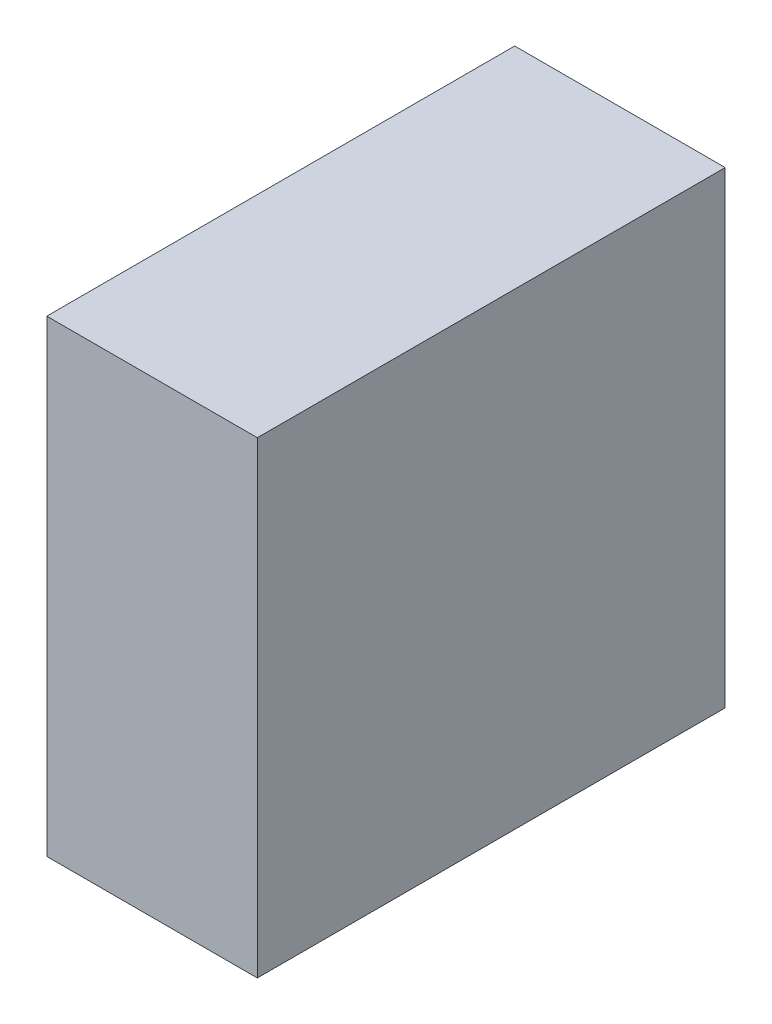
ISO-10303-21;
HEADER;
FILE_DESCRIPTION(('STEP AP214'),'2;1');
FILE_NAME('part.step','',(''),(''),'','','');
FILE_SCHEMA(('AUTOMOTIVE_DESIGN { 1 0 10303 214 1 1 1 1 }'));
ENDSEC;
DATA;
#1=APPLICATION_CONTEXT('core data for automotive mechanical design processes');
#2=APPLICATION_PROTOCOL_DEFINITION('international standard','automotive_design',2000,#1);
#3=PRODUCT_CONTEXT('',#1,'mechanical');
#4=PRODUCT('Part','Part','',(#3));
#5=PRODUCT_RELATED_PRODUCT_CATEGORY('part','',(#4));
#6=PRODUCT_DEFINITION_FORMATION('','',#4);
#7=PRODUCT_DEFINITION_CONTEXT('part definition',#1,'design');
#8=PRODUCT_DEFINITION('design','',#6,#7);
#9=PRODUCT_DEFINITION_SHAPE('','',#8);
#10=(LENGTH_UNIT() NAMED_UNIT(*) SI_UNIT(.MILLI.,.METRE.));
#11=(NAMED_UNIT(*) PLANE_ANGLE_UNIT() SI_UNIT($,.RADIAN.));
#12=(NAMED_UNIT(*) SI_UNIT($,.STERADIAN.) SOLID_ANGLE_UNIT());
#13=UNCERTAINTY_MEASURE_WITH_UNIT(LENGTH_MEASURE(1.E-05),#10,'distance_accuracy_value','');
#14=(GEOMETRIC_REPRESENTATION_CONTEXT(3) GLOBAL_UNCERTAINTY_ASSIGNED_CONTEXT((#13)) GLOBAL_UNIT_ASSIGNED_CONTEXT((#10,
#11,#12)) REPRESENTATION_CONTEXT('',''));
#15=CARTESIAN_POINT('',(0.,0.,0.));
#16=DIRECTION('',(0.,0.,1.));
#17=DIRECTION('',(1.,0.,0.));
#18=AXIS2_PLACEMENT_3D('',#15,#16,#17);
#19=CARTESIAN_POINT('',(450.,180.,-248.));
#20=DIRECTION('',(-1.,0.,0.));
#21=DIRECTION('',(0.,0.,1.));
#22=AXIS2_PLACEMENT_3D('',#19,#20,#21);
#23=PLANE('',#22);
#24=DIRECTION('',(0.,-1.,0.));
#25=VECTOR('',#24,1.);
#26=CARTESIAN_POINT('',(450.,180.,-148.));
#27=LINE('',#26,#25);
#28=CARTESIAN_POINT('',(450.,280.,-148.));
#29=VERTEX_POINT('',#28);
#30=CARTESIAN_POINT('',(450.,180.,-148.));
#31=VERTEX_POINT('',#30);
#32=EDGE_CURVE('E103',#29,#31,#27,.T.);
#33=ORIENTED_EDGE('',*,*,#32,.F.);
#34=DIRECTION('',(0.,0.,1.));
#35=VECTOR('',#34,1.);
#36=CARTESIAN_POINT('',(450.,280.,-248.));
#37=LINE('',#36,#35);
#38=CARTESIAN_POINT('',(450.,280.,-248.));
#39=VERTEX_POINT('',#38);
#40=EDGE_CURVE('E11',#39,#29,#37,.T.);
#41=ORIENTED_EDGE('',*,*,#40,.F.);
#42=DIRECTION('',(0.,-1.,0.));
#43=VECTOR('',#42,1.);
#44=CARTESIAN_POINT('',(450.,180.,-248.));
#45=LINE('',#44,#43);
#46=CARTESIAN_POINT('',(450.,180.,-248.));
#47=VERTEX_POINT('',#46);
#48=EDGE_CURVE('E97',#39,#47,#45,.T.);
#49=ORIENTED_EDGE('',*,*,#48,.T.);
#50=DIRECTION('',(0.,0.,1.));
#51=VECTOR('',#50,1.);
#52=CARTESIAN_POINT('',(450.,180.,-248.));
#53=LINE('',#52,#51);
#54=EDGE_CURVE('E42',#47,#31,#53,.T.);
#55=ORIENTED_EDGE('',*,*,#54,.T.);
#56=EDGE_LOOP('',(#33,#41,#49,#55));
#57=FACE_BOUND('',#56,.T.);
#58=ADVANCED_FACE('F39',(#57),#23,.T.);
#59=CARTESIAN_POINT('',(450.,280.,-248.));
#60=DIRECTION('',(0.,1.,0.));
#61=DIRECTION('',(0.,0.,1.));
#62=AXIS2_PLACEMENT_3D('',#59,#60,#61);
#63=PLANE('',#62);
#64=DIRECTION('',(-1.,0.,0.));
#65=VECTOR('',#64,1.);
#66=CARTESIAN_POINT('',(450.,280.,-148.));
#67=LINE('',#66,#65);
#68=CARTESIAN_POINT('',(495.,280.,-148.));
#69=VERTEX_POINT('',#68);
#70=EDGE_CURVE('E99',#69,#29,#67,.T.);
#71=ORIENTED_EDGE('',*,*,#70,.F.);
#72=DIRECTION('',(0.,0.,1.));
#73=VECTOR('',#72,1.);
#74=CARTESIAN_POINT('',(495.,280.,-248.));
#75=LINE('',#74,#73);
#76=CARTESIAN_POINT('',(495.,280.,-248.));
#77=VERTEX_POINT('',#76);
#78=EDGE_CURVE('E48',#77,#69,#75,.T.);
#79=ORIENTED_EDGE('',*,*,#78,.F.);
#80=DIRECTION('',(-1.,0.,0.));
#81=VECTOR('',#80,1.);
#82=CARTESIAN_POINT('',(450.,280.,-248.));
#83=LINE('',#82,#81);
#84=EDGE_CURVE('E94',#77,#39,#83,.T.);
#85=ORIENTED_EDGE('',*,*,#84,.T.);
#86=ORIENTED_EDGE('',*,*,#40,.T.);
#87=EDGE_LOOP('',(#71,#79,#85,#86));
#88=FACE_BOUND('',#87,.T.);
#89=ADVANCED_FACE('F113',(#88),#63,.T.);
#90=CARTESIAN_POINT('',(495.,180.,-248.));
#91=DIRECTION('',(1.,0.,0.));
#92=DIRECTION('',(0.,0.,-1.));
#93=AXIS2_PLACEMENT_3D('',#90,#91,#92);
#94=PLANE('',#93);
#95=DIRECTION('',(0.,1.,0.));
#96=VECTOR('',#95,1.);
#97=CARTESIAN_POINT('',(495.,180.,-148.));
#98=LINE('',#97,#96);
#99=CARTESIAN_POINT('',(495.,180.,-148.));
#100=VERTEX_POINT('',#99);
#101=EDGE_CURVE('E89',#100,#69,#98,.T.);
#102=ORIENTED_EDGE('',*,*,#101,.F.);
#103=DIRECTION('',(0.,0.,1.));
#104=VECTOR('',#103,1.);
#105=CARTESIAN_POINT('',(495.,180.,-248.));
#106=LINE('',#105,#104);
#107=CARTESIAN_POINT('',(495.,180.,-248.));
#108=VERTEX_POINT('',#107);
#109=EDGE_CURVE('E84',#108,#100,#106,.T.);
#110=ORIENTED_EDGE('',*,*,#109,.F.);
#111=DIRECTION('',(0.,1.,0.));
#112=VECTOR('',#111,1.);
#113=CARTESIAN_POINT('',(495.,180.,-248.));
#114=LINE('',#113,#112);
#115=EDGE_CURVE('E87',#108,#77,#114,.T.);
#116=ORIENTED_EDGE('',*,*,#115,.T.);
#117=ORIENTED_EDGE('',*,*,#78,.T.);
#118=EDGE_LOOP('',(#102,#110,#116,#117));
#119=FACE_BOUND('',#118,.T.);
#120=ADVANCED_FACE('F86',(#119),#94,.T.);
#121=CARTESIAN_POINT('',(450.,180.,-248.));
#122=DIRECTION('',(0.,-1.,0.));
#123=DIRECTION('',(0.,0.,-1.));
#124=AXIS2_PLACEMENT_3D('',#121,#122,#123);
#125=PLANE('',#124);
#126=DIRECTION('',(1.,0.,0.));
#127=VECTOR('',#126,1.);
#128=CARTESIAN_POINT('',(450.,180.,-148.));
#129=LINE('',#128,#127);
#130=EDGE_CURVE('E106',#31,#100,#129,.T.);
#131=ORIENTED_EDGE('',*,*,#130,.F.);
#132=ORIENTED_EDGE('',*,*,#54,.F.);
#133=DIRECTION('',(1.,0.,0.));
#134=VECTOR('',#133,1.);
#135=CARTESIAN_POINT('',(450.,180.,-248.));
#136=LINE('',#135,#134);
#137=EDGE_CURVE('E93',#47,#108,#136,.T.);
#138=ORIENTED_EDGE('',*,*,#137,.T.);
#139=ORIENTED_EDGE('',*,*,#109,.T.);
#140=EDGE_LOOP('',(#131,#132,#138,#139));
#141=FACE_BOUND('',#140,.T.);
#142=ADVANCED_FACE('F96',(#141),#125,.T.);
#143=CARTESIAN_POINT('',(0.,0.,-248.));
#144=DIRECTION('',(0.,0.,-1.));
#145=DIRECTION('',(-1.,0.,0.));
#146=AXIS2_PLACEMENT_3D('',#143,#144,#145);
#147=PLANE('',#146);
#148=ORIENTED_EDGE('',*,*,#48,.F.);
#149=ORIENTED_EDGE('',*,*,#84,.F.);
#150=ORIENTED_EDGE('',*,*,#115,.F.);
#151=ORIENTED_EDGE('',*,*,#137,.F.);
#152=EDGE_LOOP('',(#148,#149,#150,#151));
#153=FACE_BOUND('',#152,.T.);
#154=ADVANCED_FACE('F92',(#153),#147,.T.);
#155=CARTESIAN_POINT('',(0.,0.,-148.));
#156=DIRECTION('',(0.,0.,-1.));
#157=DIRECTION('',(-1.,0.,0.));
#158=AXIS2_PLACEMENT_3D('',#155,#156,#157);
#159=PLANE('',#158);
#160=ORIENTED_EDGE('',*,*,#32,.T.);
#161=ORIENTED_EDGE('',*,*,#130,.T.);
#162=ORIENTED_EDGE('',*,*,#101,.T.);
#163=ORIENTED_EDGE('',*,*,#70,.T.);
#164=EDGE_LOOP('',(#160,#161,#162,#163));
#165=FACE_BOUND('',#164,.T.);
#166=ADVANCED_FACE('F112',(#165),#159,.F.);
#167=CLOSED_SHELL('',(#58,#89,#120,#142,#154,#166));
#168=MANIFOLD_SOLID_BREP('B2',#167);
#169=ADVANCED_BREP_SHAPE_REPRESENTATION('',(#18,#168),#14);
#170=SHAPE_DEFINITION_REPRESENTATION(#9,#169);
ENDSEC;
END-ISO-10303-21;
